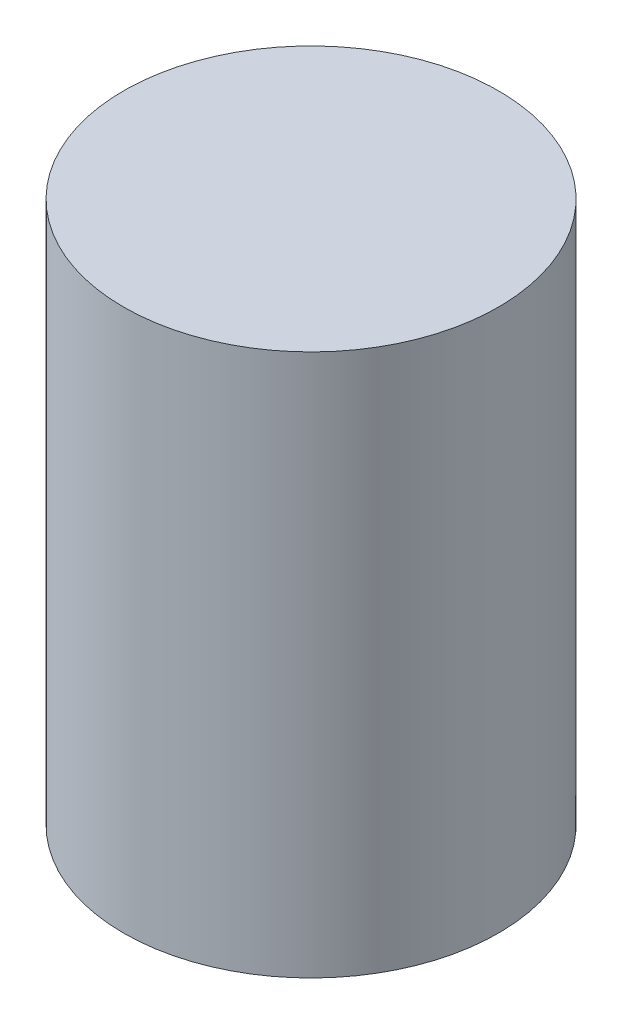
ISO-10303-21;
HEADER;
FILE_DESCRIPTION(('STEP AP214'),'2;1');
FILE_NAME('part.step','',(''),(''),'','','');
FILE_SCHEMA(('AUTOMOTIVE_DESIGN { 1 0 10303 214 1 1 1 1 }'));
ENDSEC;
DATA;
#1=APPLICATION_CONTEXT('core data for automotive mechanical design processes');
#2=APPLICATION_PROTOCOL_DEFINITION('international standard','automotive_design',2000,#1);
#3=PRODUCT_CONTEXT('',#1,'mechanical');
#4=PRODUCT('Part','Part','',(#3));
#5=PRODUCT_RELATED_PRODUCT_CATEGORY('part','',(#4));
#6=PRODUCT_DEFINITION_FORMATION('','',#4);
#7=PRODUCT_DEFINITION_CONTEXT('part definition',#1,'design');
#8=PRODUCT_DEFINITION('design','',#6,#7);
#9=PRODUCT_DEFINITION_SHAPE('','',#8);
#10=(LENGTH_UNIT() NAMED_UNIT(*) SI_UNIT(.MILLI.,.METRE.));
#11=(NAMED_UNIT(*) PLANE_ANGLE_UNIT() SI_UNIT($,.RADIAN.));
#12=(NAMED_UNIT(*) SI_UNIT($,.STERADIAN.) SOLID_ANGLE_UNIT());
#13=UNCERTAINTY_MEASURE_WITH_UNIT(LENGTH_MEASURE(1.E-05),#10,'distance_accuracy_value','');
#14=(GEOMETRIC_REPRESENTATION_CONTEXT(3) GLOBAL_UNCERTAINTY_ASSIGNED_CONTEXT((#13)) GLOBAL_UNIT_ASSIGNED_CONTEXT((#10,
#11,#12)) REPRESENTATION_CONTEXT('',''));
#15=CARTESIAN_POINT('',(0.,0.,0.));
#16=DIRECTION('',(0.,0.,1.));
#17=DIRECTION('',(1.,0.,0.));
#18=AXIS2_PLACEMENT_3D('',#15,#16,#17);
#19=CARTESIAN_POINT('',(0.,43.4,0.));
#20=DIRECTION('',(0.,-1.,0.));
#21=DIRECTION('',(0.,0.,-1.));
#22=AXIS2_PLACEMENT_3D('',#19,#20,#21);
#23=CYLINDRICAL_SURFACE('',#22,15.);
#24=CARTESIAN_POINT('',(0.,43.4,0.));
#25=DIRECTION('',(0.,1.,0.));
#26=DIRECTION('',(0.,0.,1.));
#27=AXIS2_PLACEMENT_3D('',#24,#25,#26);
#28=CIRCLE('',#27,15.);
#29=CARTESIAN_POINT('',(0.,43.4,15.));
#30=VERTEX_POINT('',#29);
#31=EDGE_CURVE('E10',#30,#30,#28,.T.);
#32=ORIENTED_EDGE('',*,*,#31,.F.);
#33=EDGE_LOOP('',(#32));
#34=FACE_BOUND('',#33,.T.);
#35=CARTESIAN_POINT('',(0.,0.,0.));
#36=DIRECTION('',(0.,1.,0.));
#37=DIRECTION('',(0.,0.,1.));
#38=AXIS2_PLACEMENT_3D('',#35,#36,#37);
#39=CIRCLE('',#38,15.);
#40=CARTESIAN_POINT('',(0.,0.,15.));
#41=VERTEX_POINT('',#40);
#42=EDGE_CURVE('E33',#41,#41,#39,.T.);
#43=ORIENTED_EDGE('',*,*,#42,.T.);
#44=EDGE_LOOP('',(#43));
#45=FACE_BOUND('',#44,.T.);
#46=ADVANCED_FACE('F30',(#34,#45),#23,.T.);
#47=CARTESIAN_POINT('',(0.,43.4,0.));
#48=DIRECTION('',(0.,1.,0.));
#49=DIRECTION('',(0.,0.,1.));
#50=AXIS2_PLACEMENT_3D('',#47,#48,#49);
#51=PLANE('',#50);
#52=ORIENTED_EDGE('',*,*,#31,.T.);
#53=EDGE_LOOP('',(#52));
#54=FACE_BOUND('',#53,.T.);
#55=ADVANCED_FACE('F45',(#54),#51,.T.);
#56=CARTESIAN_POINT('',(0.,0.,0.));
#57=DIRECTION('',(0.,1.,0.));
#58=DIRECTION('',(0.,0.,1.));
#59=AXIS2_PLACEMENT_3D('',#56,#57,#58);
#60=PLANE('',#59);
#61=ORIENTED_EDGE('',*,*,#42,.F.);
#62=EDGE_LOOP('',(#61));
#63=FACE_BOUND('',#62,.T.);
#64=ADVANCED_FACE('F43',(#63),#60,.F.);
#65=CLOSED_SHELL('',(#46,#55,#64));
#66=MANIFOLD_SOLID_BREP('B2',#65);
#67=ADVANCED_BREP_SHAPE_REPRESENTATION('',(#18,#66),#14);
#68=SHAPE_DEFINITION_REPRESENTATION(#9,#67);
ENDSEC;
END-ISO-10303-21;
